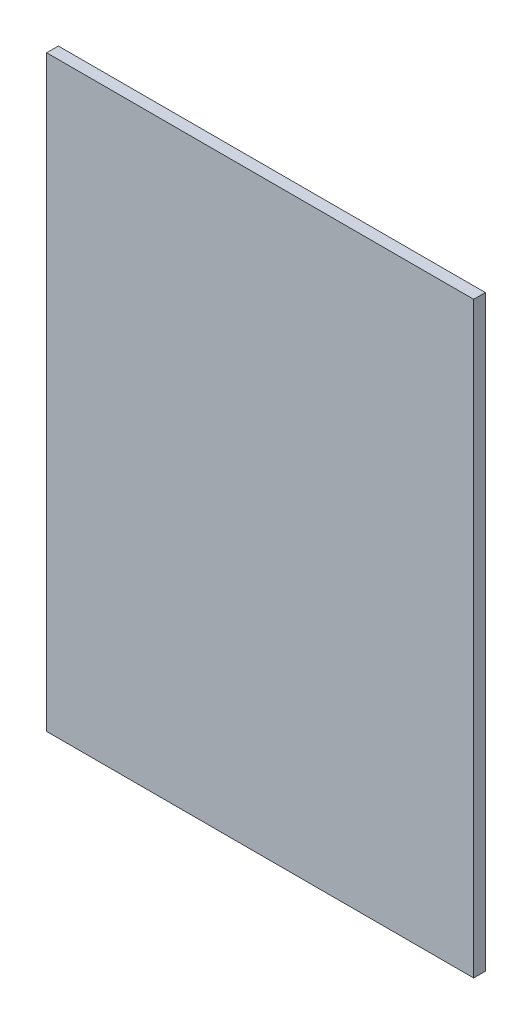
ISO-10303-21;
HEADER;
FILE_DESCRIPTION(('STEP AP214'),'2;1');
FILE_NAME('part.step','',(''),(''),'','','');
FILE_SCHEMA(('AUTOMOTIVE_DESIGN { 1 0 10303 214 1 1 1 1 }'));
ENDSEC;
DATA;
#1=APPLICATION_CONTEXT('core data for automotive mechanical design processes');
#2=APPLICATION_PROTOCOL_DEFINITION('international standard','automotive_design',2000,#1);
#3=PRODUCT_CONTEXT('',#1,'mechanical');
#4=PRODUCT('Part','Part','',(#3));
#5=PRODUCT_RELATED_PRODUCT_CATEGORY('part','',(#4));
#6=PRODUCT_DEFINITION_FORMATION('','',#4);
#7=PRODUCT_DEFINITION_CONTEXT('part definition',#1,'design');
#8=PRODUCT_DEFINITION('design','',#6,#7);
#9=PRODUCT_DEFINITION_SHAPE('','',#8);
#10=(LENGTH_UNIT() NAMED_UNIT(*) SI_UNIT(.MILLI.,.METRE.));
#11=(NAMED_UNIT(*) PLANE_ANGLE_UNIT() SI_UNIT($,.RADIAN.));
#12=(NAMED_UNIT(*) SI_UNIT($,.STERADIAN.) SOLID_ANGLE_UNIT());
#13=UNCERTAINTY_MEASURE_WITH_UNIT(LENGTH_MEASURE(1.E-05),#10,'distance_accuracy_value','');
#14=(GEOMETRIC_REPRESENTATION_CONTEXT(3) GLOBAL_UNCERTAINTY_ASSIGNED_CONTEXT((#13)) GLOBAL_UNIT_ASSIGNED_CONTEXT((#10,
#11,#12)) REPRESENTATION_CONTEXT('',''));
#15=CARTESIAN_POINT('',(0.,0.,0.));
#16=DIRECTION('',(0.,0.,1.));
#17=DIRECTION('',(1.,0.,0.));
#18=AXIS2_PLACEMENT_3D('',#15,#16,#17);
#19=CARTESIAN_POINT('',(1.913,2.7,0.));
#20=DIRECTION('',(0.,0.,1.));
#21=DIRECTION('',(1.,0.,0.));
#22=AXIS2_PLACEMENT_3D('',#19,#20,#21);
#23=PLANE('',#22);
#24=DIRECTION('',(1.,0.,0.));
#25=VECTOR('',#24,1.);
#26=CARTESIAN_POINT('',(3.738,5.212,0.));
#27=LINE('',#26,#25);
#28=CARTESIAN_POINT('',(3.738,5.212,0.));
#29=VERTEX_POINT('',#28);
#30=CARTESIAN_POINT('',(0.0879999999999997,5.212,0.));
#31=VERTEX_POINT('',#30);
#32=EDGE_CURVE('E79',#29,#31,#27,.F.);
#33=ORIENTED_EDGE('',*,*,#32,.F.);
#34=DIRECTION('',(0.,1.,0.));
#35=VECTOR('',#34,1.);
#36=CARTESIAN_POINT('',(3.738,0.188,0.));
#37=LINE('',#36,#35);
#38=CARTESIAN_POINT('',(3.738,0.188,0.));
#39=VERTEX_POINT('',#38);
#40=EDGE_CURVE('E55',#39,#29,#37,.T.);
#41=ORIENTED_EDGE('',*,*,#40,.F.);
#42=DIRECTION('',(1.,0.,0.));
#43=VECTOR('',#42,1.);
#44=CARTESIAN_POINT('',(0.088,0.188,0.));
#45=LINE('',#44,#43);
#46=CARTESIAN_POINT('',(0.0879999999999999,0.188,0.));
#47=VERTEX_POINT('',#46);
#48=EDGE_CURVE('E57',#47,#39,#45,.T.);
#49=ORIENTED_EDGE('',*,*,#48,.F.);
#50=DIRECTION('',(0.,-1.,0.));
#51=VECTOR('',#50,1.);
#52=CARTESIAN_POINT('',(0.0879999999999997,5.212,0.));
#53=LINE('',#52,#51);
#54=EDGE_CURVE('E20',#31,#47,#53,.T.);
#55=ORIENTED_EDGE('',*,*,#54,.F.);
#56=EDGE_LOOP('',(#33,#41,#49,#55));
#57=FACE_BOUND('',#56,.T.);
#58=ADVANCED_FACE('F17',(#57),#23,.F.);
#59=CARTESIAN_POINT('',(0.0879999999999997,5.212,0.));
#60=DIRECTION('',(-1.,0.,0.));
#61=DIRECTION('',(0.,-1.,0.));
#62=AXIS2_PLACEMENT_3D('',#59,#60,#61);
#63=PLANE('',#62);
#64=DIRECTION('',(0.,1.,0.));
#65=VECTOR('',#64,1.);
#66=CARTESIAN_POINT('',(0.0879999999999998,2.7,0.1));
#67=LINE('',#66,#65);
#68=CARTESIAN_POINT('',(0.0879999999999997,5.212,0.1));
#69=VERTEX_POINT('',#68);
#70=CARTESIAN_POINT('',(0.0879999999999999,0.188,0.1));
#71=VERTEX_POINT('',#70);
#72=EDGE_CURVE('E83',#69,#71,#67,.F.);
#73=ORIENTED_EDGE('',*,*,#72,.F.);
#74=DIRECTION('',(0.,0.,1.));
#75=VECTOR('',#74,1.);
#76=CARTESIAN_POINT('',(0.0879999999999995,5.212,0.));
#77=LINE('',#76,#75);
#78=EDGE_CURVE('E68',#31,#69,#77,.T.);
#79=ORIENTED_EDGE('',*,*,#78,.F.);
#80=ORIENTED_EDGE('',*,*,#54,.T.);
#81=DIRECTION('',(0.,0.,-1.));
#82=VECTOR('',#81,1.);
#83=CARTESIAN_POINT('',(0.088,0.188,0.));
#84=LINE('',#83,#82);
#85=EDGE_CURVE('E63',#71,#47,#84,.T.);
#86=ORIENTED_EDGE('',*,*,#85,.F.);
#87=EDGE_LOOP('',(#73,#79,#80,#86));
#88=FACE_BOUND('',#87,.T.);
#89=ADVANCED_FACE('F65',(#88),#63,.T.);
#90=CARTESIAN_POINT('',(0.088,0.188,0.));
#91=DIRECTION('',(0.,-1.,0.));
#92=DIRECTION('',(0.,0.,-1.));
#93=AXIS2_PLACEMENT_3D('',#90,#91,#92);
#94=PLANE('',#93);
#95=DIRECTION('',(1.,0.,0.));
#96=VECTOR('',#95,1.);
#97=CARTESIAN_POINT('',(1.913,0.188,0.1));
#98=LINE('',#97,#96);
#99=CARTESIAN_POINT('',(3.738,0.188,0.1));
#100=VERTEX_POINT('',#99);
#101=EDGE_CURVE('E72',#71,#100,#98,.T.);
#102=ORIENTED_EDGE('',*,*,#101,.F.);
#103=ORIENTED_EDGE('',*,*,#85,.T.);
#104=ORIENTED_EDGE('',*,*,#48,.T.);
#105=DIRECTION('',(0.,0.,-1.));
#106=VECTOR('',#105,1.);
#107=CARTESIAN_POINT('',(3.738,0.188,0.));
#108=LINE('',#107,#106);
#109=EDGE_CURVE('E75',#100,#39,#108,.T.);
#110=ORIENTED_EDGE('',*,*,#109,.F.);
#111=EDGE_LOOP('',(#102,#103,#104,#110));
#112=FACE_BOUND('',#111,.T.);
#113=ADVANCED_FACE('F70',(#112),#94,.T.);
#114=CARTESIAN_POINT('',(3.738,0.188,0.));
#115=DIRECTION('',(1.,0.,0.));
#116=DIRECTION('',(0.,0.,-1.));
#117=AXIS2_PLACEMENT_3D('',#114,#115,#116);
#118=PLANE('',#117);
#119=DIRECTION('',(0.,1.,0.));
#120=VECTOR('',#119,1.);
#121=CARTESIAN_POINT('',(3.738,2.7,0.1));
#122=LINE('',#121,#120);
#123=CARTESIAN_POINT('',(3.738,5.212,0.1));
#124=VERTEX_POINT('',#123);
#125=EDGE_CURVE('E26',#100,#124,#122,.T.);
#126=ORIENTED_EDGE('',*,*,#125,.F.);
#127=ORIENTED_EDGE('',*,*,#109,.T.);
#128=ORIENTED_EDGE('',*,*,#40,.T.);
#129=DIRECTION('',(0.,0.,1.));
#130=VECTOR('',#129,1.);
#131=CARTESIAN_POINT('',(3.738,5.212,0.));
#132=LINE('',#131,#130);
#133=EDGE_CURVE('E35',#124,#29,#132,.F.);
#134=ORIENTED_EDGE('',*,*,#133,.F.);
#135=EDGE_LOOP('',(#126,#127,#128,#134));
#136=FACE_BOUND('',#135,.T.);
#137=ADVANCED_FACE('F89',(#136),#118,.T.);
#138=CARTESIAN_POINT('',(3.738,5.212,0.));
#139=DIRECTION('',(0.,1.,0.));
#140=DIRECTION('',(0.,0.,1.));
#141=AXIS2_PLACEMENT_3D('',#138,#139,#140);
#142=PLANE('',#141);
#143=DIRECTION('',(1.,0.,0.));
#144=VECTOR('',#143,1.);
#145=CARTESIAN_POINT('',(1.913,5.212,0.1));
#146=LINE('',#145,#144);
#147=EDGE_CURVE('E11',#124,#69,#146,.F.);
#148=ORIENTED_EDGE('',*,*,#147,.F.);
#149=ORIENTED_EDGE('',*,*,#133,.T.);
#150=ORIENTED_EDGE('',*,*,#32,.T.);
#151=ORIENTED_EDGE('',*,*,#78,.T.);
#152=EDGE_LOOP('',(#148,#149,#150,#151));
#153=FACE_BOUND('',#152,.T.);
#154=ADVANCED_FACE('F91',(#153),#142,.T.);
#155=CARTESIAN_POINT('',(1.913,2.7,0.1));
#156=DIRECTION('',(0.,0.,1.));
#157=DIRECTION('',(1.,0.,0.));
#158=AXIS2_PLACEMENT_3D('',#155,#156,#157);
#159=PLANE('',#158);
#160=ORIENTED_EDGE('',*,*,#125,.T.);
#161=ORIENTED_EDGE('',*,*,#147,.T.);
#162=ORIENTED_EDGE('',*,*,#72,.T.);
#163=ORIENTED_EDGE('',*,*,#101,.T.);
#164=EDGE_LOOP('',(#160,#161,#162,#163));
#165=FACE_BOUND('',#164,.T.);
#166=ADVANCED_FACE('F88',(#165),#159,.T.);
#167=CLOSED_SHELL('',(#58,#89,#113,#137,#154,#166));
#168=MANIFOLD_SOLID_BREP('B1',#167);
#169=ADVANCED_BREP_SHAPE_REPRESENTATION('',(#18,#168),#14);
#170=SHAPE_DEFINITION_REPRESENTATION(#9,#169);
ENDSEC;
END-ISO-10303-21;
